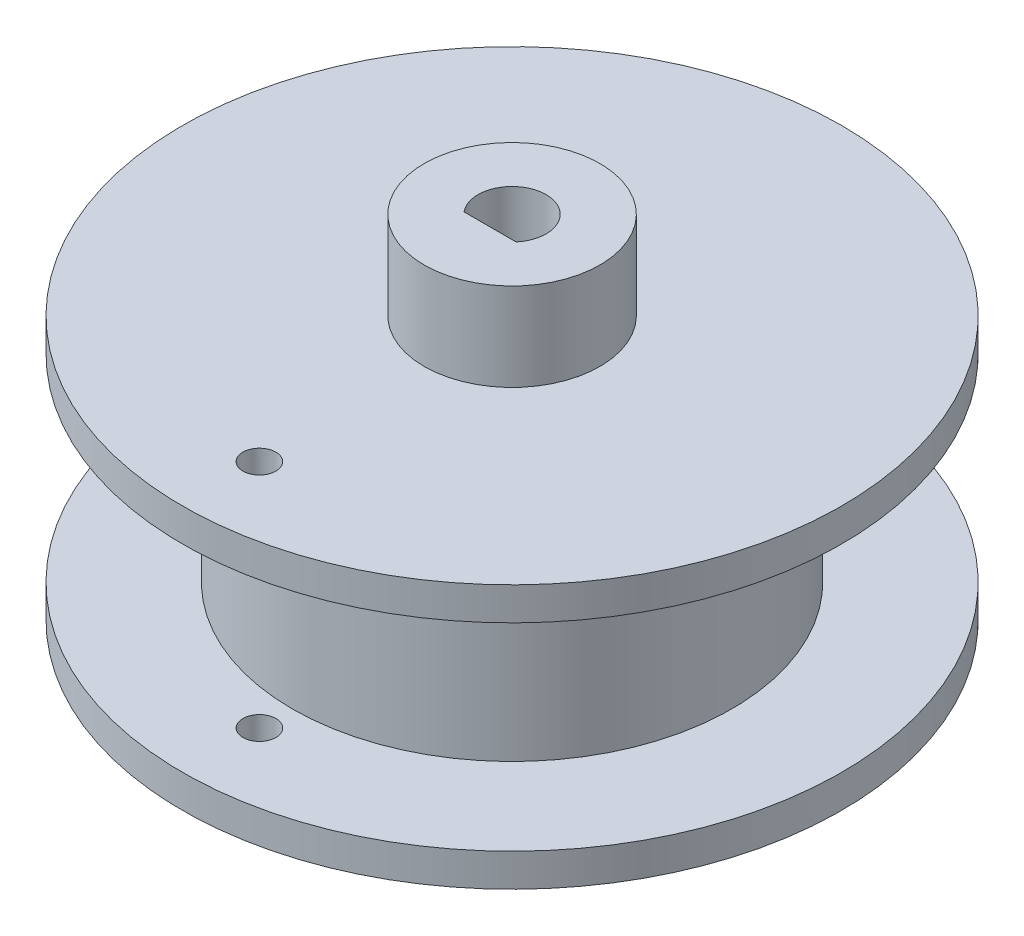
ISO-10303-21;
HEADER;
FILE_DESCRIPTION(('STEP AP214'),'2;1');
FILE_NAME('part.step','',(''),(''),'','','');
FILE_SCHEMA(('AUTOMOTIVE_DESIGN { 1 0 10303 214 1 1 1 1 }'));
ENDSEC;
DATA;
#1=APPLICATION_CONTEXT('core data for automotive mechanical design processes');
#2=APPLICATION_PROTOCOL_DEFINITION('international standard','automotive_design',2000,#1);
#3=PRODUCT_CONTEXT('',#1,'mechanical');
#4=PRODUCT('Part','Part','',(#3));
#5=PRODUCT_RELATED_PRODUCT_CATEGORY('part','',(#4));
#6=PRODUCT_DEFINITION_FORMATION('','',#4);
#7=PRODUCT_DEFINITION_CONTEXT('part definition',#1,'design');
#8=PRODUCT_DEFINITION('design','',#6,#7);
#9=PRODUCT_DEFINITION_SHAPE('','',#8);
#10=(LENGTH_UNIT() NAMED_UNIT(*) SI_UNIT(.MILLI.,.METRE.));
#11=(NAMED_UNIT(*) PLANE_ANGLE_UNIT() SI_UNIT($,.RADIAN.));
#12=(NAMED_UNIT(*) SI_UNIT($,.STERADIAN.) SOLID_ANGLE_UNIT());
#13=UNCERTAINTY_MEASURE_WITH_UNIT(LENGTH_MEASURE(1.E-05),#10,'distance_accuracy_value','');
#14=(GEOMETRIC_REPRESENTATION_CONTEXT(3) GLOBAL_UNCERTAINTY_ASSIGNED_CONTEXT((#13)) GLOBAL_UNIT_ASSIGNED_CONTEXT((#10,
#11,#12)) REPRESENTATION_CONTEXT('',''));
#15=CARTESIAN_POINT('',(0.,0.,0.));
#16=DIRECTION('',(0.,0.,1.));
#17=DIRECTION('',(1.,0.,0.));
#18=AXIS2_PLACEMENT_3D('',#15,#16,#17);
#19=CARTESIAN_POINT('',(15.,0.,0.));
#20=DIRECTION('',(0.,-1.,0.));
#21=DIRECTION('',(0.,0.,-1.));
#22=AXIS2_PLACEMENT_3D('',#19,#20,#21);
#23=PLANE('',#22);
#24=CARTESIAN_POINT('',(0.,0.,11.5));
#25=DIRECTION('',(0.,-1.,0.));
#26=DIRECTION('',(0.,0.,-1.));
#27=AXIS2_PLACEMENT_3D('',#24,#25,#26);
#28=CIRCLE('',#27,0.75);
#29=CARTESIAN_POINT('',(0.,0.,10.75));
#30=VERTEX_POINT('',#29);
#31=EDGE_CURVE('E133',#30,#30,#28,.T.);
#32=ORIENTED_EDGE('',*,*,#31,.F.);
#33=EDGE_LOOP('',(#32));
#34=FACE_BOUND('',#33,.T.);
#35=CARTESIAN_POINT('',(0.,0.,0.));
#36=DIRECTION('',(0.,-1.,0.));
#37=DIRECTION('',(0.,0.,-1.));
#38=AXIS2_PLACEMENT_3D('',#35,#36,#37);
#39=CIRCLE('',#38,15.);
#40=CARTESIAN_POINT('',(0.,0.,-15.));
#41=VERTEX_POINT('',#40);
#42=EDGE_CURVE('E89',#41,#41,#39,.T.);
#43=ORIENTED_EDGE('',*,*,#42,.T.);
#44=EDGE_LOOP('',(#43));
#45=FACE_BOUND('',#44,.T.);
#46=CARTESIAN_POINT('',(0.,0.,0.));
#47=DIRECTION('',(0.,-1.,0.));
#48=DIRECTION('',(0.,0.,-1.));
#49=AXIS2_PLACEMENT_3D('',#46,#47,#48);
#50=CIRCLE('',#49,1.55);
#51=CARTESIAN_POINT('',(-1.1842719282327,0.,1.));
#52=VERTEX_POINT('',#51);
#53=CARTESIAN_POINT('',(1.1842719282327,0.,0.999999999999998));
#54=VERTEX_POINT('',#53);
#55=EDGE_CURVE('E73',#52,#54,#50,.T.);
#56=ORIENTED_EDGE('',*,*,#55,.F.);
#57=DIRECTION('',(1.,0.,0.));
#58=VECTOR('',#57,1.);
#59=CARTESIAN_POINT('',(-1.1842719282327,0.,1.));
#60=LINE('',#59,#58);
#61=EDGE_CURVE('E54',#52,#54,#60,.T.);
#62=ORIENTED_EDGE('',*,*,#61,.T.);
#63=EDGE_LOOP('',(#56,#62));
#64=FACE_BOUND('',#63,.T.);
#65=ADVANCED_FACE('F39',(#34,#45,#64),#23,.T.);
#66=CARTESIAN_POINT('',(0.,16.,0.));
#67=DIRECTION('',(0.,1.,0.));
#68=DIRECTION('',(0.,0.,1.));
#69=AXIS2_PLACEMENT_3D('',#66,#67,#68);
#70=PLANE('',#69);
#71=CARTESIAN_POINT('',(0.,16.,0.));
#72=DIRECTION('',(0.,1.,0.));
#73=DIRECTION('',(0.,0.,1.));
#74=AXIS2_PLACEMENT_3D('',#71,#72,#73);
#75=CIRCLE('',#74,4.);
#76=CARTESIAN_POINT('',(0.,16.,4.));
#77=VERTEX_POINT('',#76);
#78=EDGE_CURVE('E72',#77,#77,#75,.T.);
#79=ORIENTED_EDGE('',*,*,#78,.T.);
#80=EDGE_LOOP('',(#79));
#81=FACE_BOUND('',#80,.T.);
#82=CARTESIAN_POINT('',(0.,16.,0.));
#83=DIRECTION('',(0.,-1.,0.));
#84=DIRECTION('',(0.,0.,-1.));
#85=AXIS2_PLACEMENT_3D('',#82,#83,#84);
#86=CIRCLE('',#85,1.55);
#87=CARTESIAN_POINT('',(-1.1842719282327,16.,1.));
#88=VERTEX_POINT('',#87);
#89=CARTESIAN_POINT('',(1.1842719282327,16.,0.999999999999998));
#90=VERTEX_POINT('',#89);
#91=EDGE_CURVE('E84',#88,#90,#86,.T.);
#92=ORIENTED_EDGE('',*,*,#91,.T.);
#93=DIRECTION('',(1.,0.,0.));
#94=VECTOR('',#93,1.);
#95=CARTESIAN_POINT('',(-1.1842719282327,16.,1.));
#96=LINE('',#95,#94);
#97=EDGE_CURVE('E67',#88,#90,#96,.T.);
#98=ORIENTED_EDGE('',*,*,#97,.F.);
#99=EDGE_LOOP('',(#92,#98));
#100=FACE_BOUND('',#99,.T.);
#101=ADVANCED_FACE('F114',(#81,#100),#70,.T.);
#102=CARTESIAN_POINT('',(0.,12.,0.));
#103=DIRECTION('',(0.,1.,0.));
#104=DIRECTION('',(0.,0.,1.));
#105=AXIS2_PLACEMENT_3D('',#102,#103,#104);
#106=PLANE('',#105);
#107=CARTESIAN_POINT('',(0.,12.,11.5));
#108=DIRECTION('',(0.,1.,0.));
#109=DIRECTION('',(0.,0.,1.));
#110=AXIS2_PLACEMENT_3D('',#107,#108,#109);
#111=CIRCLE('',#110,0.75);
#112=CARTESIAN_POINT('',(0.,12.,12.25));
#113=VERTEX_POINT('',#112);
#114=EDGE_CURVE('E78',#113,#113,#111,.T.);
#115=ORIENTED_EDGE('',*,*,#114,.F.);
#116=EDGE_LOOP('',(#115));
#117=FACE_BOUND('',#116,.T.);
#118=CARTESIAN_POINT('',(0.,12.,0.));
#119=DIRECTION('',(0.,1.,0.));
#120=DIRECTION('',(0.,0.,1.));
#121=AXIS2_PLACEMENT_3D('',#118,#119,#120);
#122=CIRCLE('',#121,4.);
#123=CARTESIAN_POINT('',(0.,12.,4.));
#124=VERTEX_POINT('',#123);
#125=EDGE_CURVE('E11',#124,#124,#122,.T.);
#126=ORIENTED_EDGE('',*,*,#125,.F.);
#127=EDGE_LOOP('',(#126));
#128=FACE_BOUND('',#127,.T.);
#129=CARTESIAN_POINT('',(0.,12.,0.));
#130=DIRECTION('',(0.,-1.,0.));
#131=DIRECTION('',(0.,0.,-1.));
#132=AXIS2_PLACEMENT_3D('',#129,#130,#131);
#133=CIRCLE('',#132,15.);
#134=CARTESIAN_POINT('',(0.,12.,-15.));
#135=VERTEX_POINT('',#134);
#136=EDGE_CURVE('E50',#135,#135,#133,.T.);
#137=ORIENTED_EDGE('',*,*,#136,.F.);
#138=EDGE_LOOP('',(#137));
#139=FACE_BOUND('',#138,.T.);
#140=ADVANCED_FACE('F112',(#117,#128,#139),#106,.T.);
#141=CARTESIAN_POINT('',(0.,0.,0.));
#142=DIRECTION('',(0.,-1.,0.));
#143=DIRECTION('',(0.,0.,-1.));
#144=AXIS2_PLACEMENT_3D('',#141,#142,#143);
#145=CYLINDRICAL_SURFACE('',#144,15.);
#146=ORIENTED_EDGE('',*,*,#136,.T.);
#147=EDGE_LOOP('',(#146));
#148=FACE_BOUND('',#147,.T.);
#149=CARTESIAN_POINT('',(0.,10.5,0.));
#150=DIRECTION('',(0.,-1.,0.));
#151=DIRECTION('',(0.,0.,-1.));
#152=AXIS2_PLACEMENT_3D('',#149,#150,#151);
#153=CIRCLE('',#152,15.);
#154=CARTESIAN_POINT('',(0.,10.5,-15.));
#155=VERTEX_POINT('',#154);
#156=EDGE_CURVE('E103',#155,#155,#153,.T.);
#157=ORIENTED_EDGE('',*,*,#156,.F.);
#158=EDGE_LOOP('',(#157));
#159=FACE_BOUND('',#158,.T.);
#160=ADVANCED_FACE('F107',(#148,#159),#145,.T.);
#161=CARTESIAN_POINT('',(15.,10.5,0.));
#162=DIRECTION('',(0.,-1.,0.));
#163=DIRECTION('',(0.,0.,-1.));
#164=AXIS2_PLACEMENT_3D('',#161,#162,#163);
#165=PLANE('',#164);
#166=CARTESIAN_POINT('',(0.,10.5,11.5));
#167=DIRECTION('',(0.,-1.,0.));
#168=DIRECTION('',(0.,0.,-1.));
#169=AXIS2_PLACEMENT_3D('',#166,#167,#168);
#170=CIRCLE('',#169,0.75);
#171=CARTESIAN_POINT('',(0.,10.5,10.75));
#172=VERTEX_POINT('',#171);
#173=EDGE_CURVE('E85',#172,#172,#170,.T.);
#174=ORIENTED_EDGE('',*,*,#173,.F.);
#175=EDGE_LOOP('',(#174));
#176=FACE_BOUND('',#175,.T.);
#177=ORIENTED_EDGE('',*,*,#156,.T.);
#178=EDGE_LOOP('',(#177));
#179=FACE_BOUND('',#178,.T.);
#180=CARTESIAN_POINT('',(0.,10.5,0.));
#181=DIRECTION('',(0.,-1.,0.));
#182=DIRECTION('',(0.,0.,-1.));
#183=AXIS2_PLACEMENT_3D('',#180,#181,#182);
#184=CIRCLE('',#183,10.);
#185=CARTESIAN_POINT('',(0.,10.5,-10.));
#186=VERTEX_POINT('',#185);
#187=EDGE_CURVE('E99',#186,#186,#184,.T.);
#188=ORIENTED_EDGE('',*,*,#187,.F.);
#189=EDGE_LOOP('',(#188));
#190=FACE_BOUND('',#189,.T.);
#191=ADVANCED_FACE('F117',(#176,#179,#190),#165,.T.);
#192=CARTESIAN_POINT('',(0.,0.,0.));
#193=DIRECTION('',(0.,-1.,0.));
#194=DIRECTION('',(0.,0.,-1.));
#195=AXIS2_PLACEMENT_3D('',#192,#193,#194);
#196=CYLINDRICAL_SURFACE('',#195,10.);
#197=ORIENTED_EDGE('',*,*,#187,.T.);
#198=EDGE_LOOP('',(#197));
#199=FACE_BOUND('',#198,.T.);
#200=CARTESIAN_POINT('',(0.,1.5,0.));
#201=DIRECTION('',(0.,-1.,0.));
#202=DIRECTION('',(0.,0.,-1.));
#203=AXIS2_PLACEMENT_3D('',#200,#201,#202);
#204=CIRCLE('',#203,10.);
#205=CARTESIAN_POINT('',(0.,1.5,-10.));
#206=VERTEX_POINT('',#205);
#207=EDGE_CURVE('E100',#206,#206,#204,.T.);
#208=ORIENTED_EDGE('',*,*,#207,.F.);
#209=EDGE_LOOP('',(#208));
#210=FACE_BOUND('',#209,.T.);
#211=ADVANCED_FACE('F147',(#199,#210),#196,.T.);
#212=CARTESIAN_POINT('',(10.,1.5,0.));
#213=DIRECTION('',(0.,1.,0.));
#214=DIRECTION('',(0.,0.,1.));
#215=AXIS2_PLACEMENT_3D('',#212,#213,#214);
#216=PLANE('',#215);
#217=CARTESIAN_POINT('',(0.,1.5,11.5));
#218=DIRECTION('',(0.,1.,0.));
#219=DIRECTION('',(0.,0.,1.));
#220=AXIS2_PLACEMENT_3D('',#217,#218,#219);
#221=CIRCLE('',#220,0.75);
#222=CARTESIAN_POINT('',(0.,1.5,12.25));
#223=VERTEX_POINT('',#222);
#224=EDGE_CURVE('E45',#223,#223,#221,.T.);
#225=ORIENTED_EDGE('',*,*,#224,.F.);
#226=EDGE_LOOP('',(#225));
#227=FACE_BOUND('',#226,.T.);
#228=ORIENTED_EDGE('',*,*,#207,.T.);
#229=EDGE_LOOP('',(#228));
#230=FACE_BOUND('',#229,.T.);
#231=CARTESIAN_POINT('',(0.,1.5,0.));
#232=DIRECTION('',(0.,-1.,0.));
#233=DIRECTION('',(0.,0.,-1.));
#234=AXIS2_PLACEMENT_3D('',#231,#232,#233);
#235=CIRCLE('',#234,15.);
#236=CARTESIAN_POINT('',(0.,1.5,-15.));
#237=VERTEX_POINT('',#236);
#238=EDGE_CURVE('E94',#237,#237,#235,.T.);
#239=ORIENTED_EDGE('',*,*,#238,.F.);
#240=EDGE_LOOP('',(#239));
#241=FACE_BOUND('',#240,.T.);
#242=ADVANCED_FACE('F139',(#227,#230,#241),#216,.T.);
#243=CARTESIAN_POINT('',(0.,0.,0.));
#244=DIRECTION('',(0.,-1.,0.));
#245=DIRECTION('',(0.,0.,-1.));
#246=AXIS2_PLACEMENT_3D('',#243,#244,#245);
#247=CYLINDRICAL_SURFACE('',#246,15.);
#248=ORIENTED_EDGE('',*,*,#238,.T.);
#249=EDGE_LOOP('',(#248));
#250=FACE_BOUND('',#249,.T.);
#251=ORIENTED_EDGE('',*,*,#42,.F.);
#252=EDGE_LOOP('',(#251));
#253=FACE_BOUND('',#252,.T.);
#254=ADVANCED_FACE('F140',(#250,#253),#247,.T.);
#255=CARTESIAN_POINT('',(0.,16.,0.));
#256=DIRECTION('',(0.,-1.,0.));
#257=DIRECTION('',(0.,0.,-1.));
#258=AXIS2_PLACEMENT_3D('',#255,#256,#257);
#259=CYLINDRICAL_SURFACE('',#258,4.);
#260=ORIENTED_EDGE('',*,*,#78,.F.);
#261=EDGE_LOOP('',(#260));
#262=FACE_BOUND('',#261,.T.);
#263=ORIENTED_EDGE('',*,*,#125,.T.);
#264=EDGE_LOOP('',(#263));
#265=FACE_BOUND('',#264,.T.);
#266=ADVANCED_FACE('F137',(#262,#265),#259,.T.);
#267=CARTESIAN_POINT('',(-1.1842719282327,16.,1.));
#268=DIRECTION('',(0.,0.,-1.));
#269=DIRECTION('',(-1.,0.,0.));
#270=AXIS2_PLACEMENT_3D('',#267,#268,#269);
#271=PLANE('',#270);
#272=ORIENTED_EDGE('',*,*,#61,.F.);
#273=DIRECTION('',(0.,-1.,0.));
#274=VECTOR('',#273,1.);
#275=CARTESIAN_POINT('',(-1.1842719282327,16.,1.));
#276=LINE('',#275,#274);
#277=EDGE_CURVE('E75',#88,#52,#276,.T.);
#278=ORIENTED_EDGE('',*,*,#277,.F.);
#279=ORIENTED_EDGE('',*,*,#97,.T.);
#280=DIRECTION('',(0.,-1.,0.));
#281=VECTOR('',#280,1.);
#282=CARTESIAN_POINT('',(1.1842719282327,16.,0.999999999999998));
#283=LINE('',#282,#281);
#284=EDGE_CURVE('E61',#90,#54,#283,.T.);
#285=ORIENTED_EDGE('',*,*,#284,.T.);
#286=EDGE_LOOP('',(#272,#278,#279,#285));
#287=FACE_BOUND('',#286,.T.);
#288=ADVANCED_FACE('F70',(#287),#271,.T.);
#289=CARTESIAN_POINT('',(0.,16.,0.));
#290=DIRECTION('',(0.,-1.,0.));
#291=DIRECTION('',(0.,0.,-1.));
#292=AXIS2_PLACEMENT_3D('',#289,#290,#291);
#293=CYLINDRICAL_SURFACE('',#292,1.55);
#294=ORIENTED_EDGE('',*,*,#55,.T.);
#295=ORIENTED_EDGE('',*,*,#284,.F.);
#296=ORIENTED_EDGE('',*,*,#91,.F.);
#297=ORIENTED_EDGE('',*,*,#277,.T.);
#298=EDGE_LOOP('',(#294,#295,#296,#297));
#299=FACE_BOUND('',#298,.T.);
#300=ADVANCED_FACE('F79',(#299),#293,.F.);
#301=CARTESIAN_POINT('',(0.,16.,11.5));
#302=DIRECTION('',(0.,-1.,0.));
#303=DIRECTION('',(0.,0.,-1.));
#304=AXIS2_PLACEMENT_3D('',#301,#302,#303);
#305=CYLINDRICAL_SURFACE('',#304,0.75);
#306=ORIENTED_EDGE('',*,*,#224,.T.);
#307=EDGE_LOOP('',(#306));
#308=FACE_BOUND('',#307,.T.);
#309=ORIENTED_EDGE('',*,*,#31,.T.);
#310=EDGE_LOOP('',(#309));
#311=FACE_BOUND('',#310,.T.);
#312=ADVANCED_FACE('F176',(#308,#311),#305,.F.);
#313=ORIENTED_EDGE('',*,*,#114,.T.);
#314=EDGE_LOOP('',(#313));
#315=FACE_BOUND('',#314,.T.);
#316=ORIENTED_EDGE('',*,*,#173,.T.);
#317=EDGE_LOOP('',(#316));
#318=FACE_BOUND('',#317,.T.);
#319=ADVANCED_FACE('F178',(#315,#318),#305,.F.);
#320=CLOSED_SHELL('',(#65,#101,#140,#160,#191,#211,#242,#254,#266,#288,#300,#312,#319));
#321=MANIFOLD_SOLID_BREP('B2',#320);
#322=ADVANCED_BREP_SHAPE_REPRESENTATION('',(#18,#321),#14);
#323=SHAPE_DEFINITION_REPRESENTATION(#9,#322);
ENDSEC;
END-ISO-10303-21;
